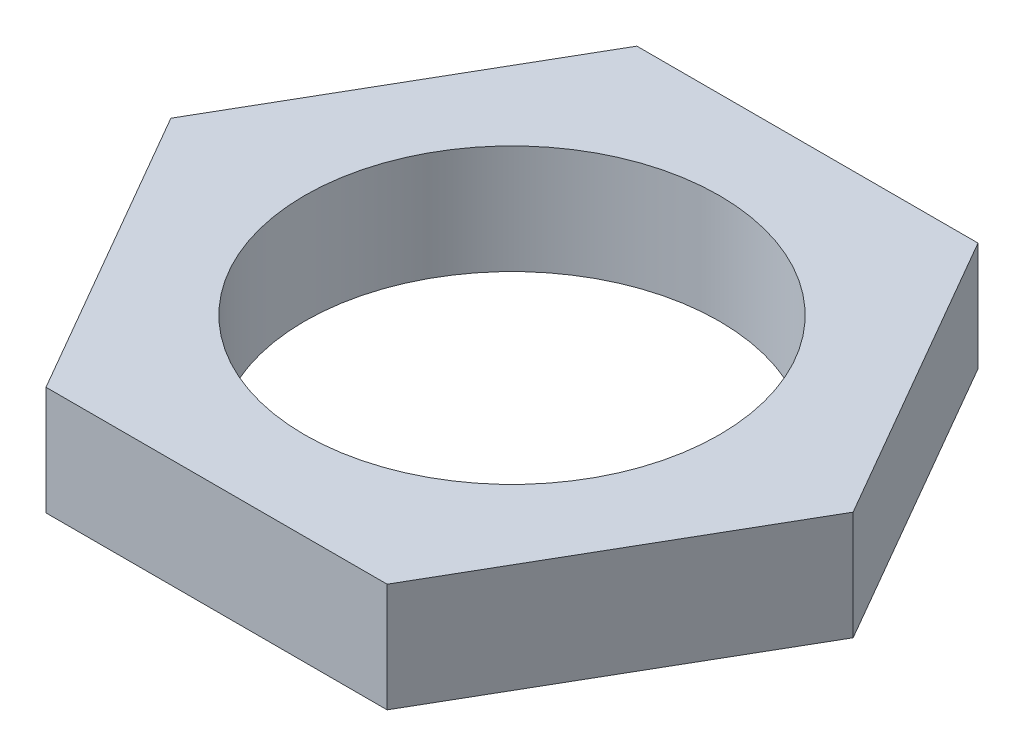
ISO-10303-21;
HEADER;
FILE_DESCRIPTION(('STEP AP214'),'2;1');
FILE_NAME('part.step','',(''),(''),'','','');
FILE_SCHEMA(('AUTOMOTIVE_DESIGN { 1 0 10303 214 1 1 1 1 }'));
ENDSEC;
DATA;
#1=APPLICATION_CONTEXT('core data for automotive mechanical design processes');
#2=APPLICATION_PROTOCOL_DEFINITION('international standard','automotive_design',2000,#1);
#3=PRODUCT_CONTEXT('',#1,'mechanical');
#4=PRODUCT('Part','Part','',(#3));
#5=PRODUCT_RELATED_PRODUCT_CATEGORY('part','',(#4));
#6=PRODUCT_DEFINITION_FORMATION('','',#4);
#7=PRODUCT_DEFINITION_CONTEXT('part definition',#1,'design');
#8=PRODUCT_DEFINITION('design','',#6,#7);
#9=PRODUCT_DEFINITION_SHAPE('','',#8);
#10=(LENGTH_UNIT() NAMED_UNIT(*) SI_UNIT(.MILLI.,.METRE.));
#11=(NAMED_UNIT(*) PLANE_ANGLE_UNIT() SI_UNIT($,.RADIAN.));
#12=(NAMED_UNIT(*) SI_UNIT($,.STERADIAN.) SOLID_ANGLE_UNIT());
#13=UNCERTAINTY_MEASURE_WITH_UNIT(LENGTH_MEASURE(1.E-05),#10,'distance_accuracy_value','');
#14=(GEOMETRIC_REPRESENTATION_CONTEXT(3) GLOBAL_UNCERTAINTY_ASSIGNED_CONTEXT((#13)) GLOBAL_UNIT_ASSIGNED_CONTEXT((#10,
#11,#12)) REPRESENTATION_CONTEXT('',''));
#15=CARTESIAN_POINT('',(0.,0.,0.));
#16=DIRECTION('',(0.,0.,1.));
#17=DIRECTION('',(1.,0.,0.));
#18=AXIS2_PLACEMENT_3D('',#15,#16,#17);
#19=CARTESIAN_POINT('',(0.,2.31,0.));
#20=DIRECTION('',(0.,1.,0.));
#21=DIRECTION('',(0.,0.,1.));
#22=AXIS2_PLACEMENT_3D('',#19,#20,#21);
#23=PLANE('',#22);
#24=DIRECTION('',(0.5,0.,0.866025403784439));
#25=VECTOR('',#24,1.);
#26=CARTESIAN_POINT('',(-7.23997237563791,2.31,0.));
#27=LINE('',#26,#25);
#28=CARTESIAN_POINT('',(-7.23997237563791,2.31,0.));
#29=VERTEX_POINT('',#28);
#30=CARTESIAN_POINT('',(-3.61998618781895,2.31,6.27));
#31=VERTEX_POINT('',#30);
#32=EDGE_CURVE('E148',#29,#31,#27,.T.);
#33=ORIENTED_EDGE('',*,*,#32,.T.);
#34=DIRECTION('',(1.,0.,0.));
#35=VECTOR('',#34,1.);
#36=CARTESIAN_POINT('',(-3.61998618781895,2.31,6.27));
#37=LINE('',#36,#35);
#38=CARTESIAN_POINT('',(3.61998618781895,2.31,6.27));
#39=VERTEX_POINT('',#38);
#40=EDGE_CURVE('E96',#31,#39,#37,.T.);
#41=ORIENTED_EDGE('',*,*,#40,.T.);
#42=DIRECTION('',(0.5,0.,-0.866025403784439));
#43=VECTOR('',#42,1.);
#44=CARTESIAN_POINT('',(3.61998618781895,2.31,6.27));
#45=LINE('',#44,#43);
#46=CARTESIAN_POINT('',(7.23997237563791,2.31,0.));
#47=VERTEX_POINT('',#46);
#48=EDGE_CURVE('E109',#39,#47,#45,.T.);
#49=ORIENTED_EDGE('',*,*,#48,.T.);
#50=DIRECTION('',(-0.5,0.,-0.866025403784438));
#51=VECTOR('',#50,1.);
#52=CARTESIAN_POINT('',(7.23997237563791,2.31,0.));
#53=LINE('',#52,#51);
#54=CARTESIAN_POINT('',(3.61998618781895,2.31,-6.27));
#55=VERTEX_POINT('',#54);
#56=EDGE_CURVE('E103',#47,#55,#53,.T.);
#57=ORIENTED_EDGE('',*,*,#56,.T.);
#58=DIRECTION('',(-1.,0.,0.));
#59=VECTOR('',#58,1.);
#60=CARTESIAN_POINT('',(3.61998618781895,2.31,-6.27));
#61=LINE('',#60,#59);
#62=CARTESIAN_POINT('',(-3.61998618781896,2.31,-6.27));
#63=VERTEX_POINT('',#62);
#64=EDGE_CURVE('E107',#55,#63,#61,.T.);
#65=ORIENTED_EDGE('',*,*,#64,.T.);
#66=DIRECTION('',(-0.5,0.,0.866025403784439));
#67=VECTOR('',#66,1.);
#68=CARTESIAN_POINT('',(-3.61998618781896,2.31,-6.27));
#69=LINE('',#68,#67);
#70=EDGE_CURVE('E59',#63,#29,#69,.T.);
#71=ORIENTED_EDGE('',*,*,#70,.T.);
#72=EDGE_LOOP('',(#33,#41,#49,#57,#65,#71));
#73=FACE_BOUND('',#72,.T.);
#74=CARTESIAN_POINT('',(0.,2.31,0.));
#75=DIRECTION('',(0.,1.,0.));
#76=DIRECTION('',(0.,0.,1.));
#77=AXIS2_PLACEMENT_3D('',#74,#75,#76);
#78=CIRCLE('',#77,4.4);
#79=CARTESIAN_POINT('',(0.,2.31,4.4));
#80=VERTEX_POINT('',#79);
#81=EDGE_CURVE('E136',#80,#80,#78,.T.);
#82=ORIENTED_EDGE('',*,*,#81,.F.);
#83=EDGE_LOOP('',(#82));
#84=FACE_BOUND('',#83,.T.);
#85=ADVANCED_FACE('F41',(#73,#84),#23,.T.);
#86=CARTESIAN_POINT('',(0.,0.,0.));
#87=DIRECTION('',(0.,1.,0.));
#88=DIRECTION('',(0.,0.,1.));
#89=AXIS2_PLACEMENT_3D('',#86,#87,#88);
#90=PLANE('',#89);
#91=DIRECTION('',(0.5,0.,0.866025403784439));
#92=VECTOR('',#91,1.);
#93=CARTESIAN_POINT('',(-7.23997237563791,0.,0.));
#94=LINE('',#93,#92);
#95=CARTESIAN_POINT('',(-7.23997237563791,0.,0.));
#96=VERTEX_POINT('',#95);
#97=CARTESIAN_POINT('',(-3.61998618781895,0.,6.27));
#98=VERTEX_POINT('',#97);
#99=EDGE_CURVE('E131',#96,#98,#94,.T.);
#100=ORIENTED_EDGE('',*,*,#99,.F.);
#101=DIRECTION('',(-0.5,0.,0.866025403784439));
#102=VECTOR('',#101,1.);
#103=CARTESIAN_POINT('',(-3.61998618781896,0.,-6.27));
#104=LINE('',#103,#102);
#105=CARTESIAN_POINT('',(-3.61998618781896,0.,-6.27));
#106=VERTEX_POINT('',#105);
#107=EDGE_CURVE('E88',#106,#96,#104,.T.);
#108=ORIENTED_EDGE('',*,*,#107,.F.);
#109=DIRECTION('',(-1.,0.,0.));
#110=VECTOR('',#109,1.);
#111=CARTESIAN_POINT('',(3.61998618781895,0.,-6.27));
#112=LINE('',#111,#110);
#113=CARTESIAN_POINT('',(3.61998618781895,0.,-6.27));
#114=VERTEX_POINT('',#113);
#115=EDGE_CURVE('E82',#114,#106,#112,.T.);
#116=ORIENTED_EDGE('',*,*,#115,.F.);
#117=DIRECTION('',(-0.5,0.,-0.866025403784438));
#118=VECTOR('',#117,1.);
#119=CARTESIAN_POINT('',(7.23997237563791,0.,0.));
#120=LINE('',#119,#118);
#121=CARTESIAN_POINT('',(7.23997237563791,0.,0.));
#122=VERTEX_POINT('',#121);
#123=EDGE_CURVE('E118',#122,#114,#120,.T.);
#124=ORIENTED_EDGE('',*,*,#123,.F.);
#125=DIRECTION('',(0.5,0.,-0.866025403784439));
#126=VECTOR('',#125,1.);
#127=CARTESIAN_POINT('',(3.61998618781895,0.,6.27));
#128=LINE('',#127,#126);
#129=CARTESIAN_POINT('',(3.61998618781895,0.,6.27));
#130=VERTEX_POINT('',#129);
#131=EDGE_CURVE('E139',#130,#122,#128,.T.);
#132=ORIENTED_EDGE('',*,*,#131,.F.);
#133=DIRECTION('',(1.,0.,0.));
#134=VECTOR('',#133,1.);
#135=CARTESIAN_POINT('',(-3.61998618781895,0.,6.27));
#136=LINE('',#135,#134);
#137=EDGE_CURVE('E135',#98,#130,#136,.T.);
#138=ORIENTED_EDGE('',*,*,#137,.F.);
#139=EDGE_LOOP('',(#100,#108,#116,#124,#132,#138));
#140=FACE_BOUND('',#139,.T.);
#141=CARTESIAN_POINT('',(0.,0.,0.));
#142=DIRECTION('',(0.,1.,0.));
#143=DIRECTION('',(0.,0.,1.));
#144=AXIS2_PLACEMENT_3D('',#141,#142,#143);
#145=CIRCLE('',#144,4.4);
#146=CARTESIAN_POINT('',(0.,0.,4.4));
#147=VERTEX_POINT('',#146);
#148=EDGE_CURVE('E245',#147,#147,#145,.T.);
#149=ORIENTED_EDGE('',*,*,#148,.T.);
#150=EDGE_LOOP('',(#149));
#151=FACE_BOUND('',#150,.T.);
#152=ADVANCED_FACE('F161',(#140,#151),#90,.F.);
#153=CARTESIAN_POINT('',(-7.23997237563791,2.31,0.));
#154=DIRECTION('',(0.866025403784439,0.,-0.5));
#155=DIRECTION('',(-0.5,0.,-0.866025403784439));
#156=AXIS2_PLACEMENT_3D('',#153,#154,#155);
#157=PLANE('',#156);
#158=ORIENTED_EDGE('',*,*,#99,.T.);
#159=DIRECTION('',(0.,-1.,0.));
#160=VECTOR('',#159,1.);
#161=CARTESIAN_POINT('',(-3.61998618781895,2.31,6.27));
#162=LINE('',#161,#160);
#163=EDGE_CURVE('E11',#31,#98,#162,.T.);
#164=ORIENTED_EDGE('',*,*,#163,.F.);
#165=ORIENTED_EDGE('',*,*,#32,.F.);
#166=DIRECTION('',(0.,-1.,0.));
#167=VECTOR('',#166,1.);
#168=CARTESIAN_POINT('',(-7.23997237563791,2.31,0.));
#169=LINE('',#168,#167);
#170=EDGE_CURVE('E127',#29,#96,#169,.T.);
#171=ORIENTED_EDGE('',*,*,#170,.T.);
#172=EDGE_LOOP('',(#158,#164,#165,#171));
#173=FACE_BOUND('',#172,.T.);
#174=ADVANCED_FACE('F43',(#173),#157,.F.);
#175=CARTESIAN_POINT('',(-3.61998618781895,2.31,6.27));
#176=DIRECTION('',(0.,0.,-1.));
#177=DIRECTION('',(-1.,0.,0.));
#178=AXIS2_PLACEMENT_3D('',#175,#176,#177);
#179=PLANE('',#178);
#180=ORIENTED_EDGE('',*,*,#137,.T.);
#181=DIRECTION('',(0.,-1.,0.));
#182=VECTOR('',#181,1.);
#183=CARTESIAN_POINT('',(3.61998618781895,2.31,6.27));
#184=LINE('',#183,#182);
#185=EDGE_CURVE('E51',#39,#130,#184,.T.);
#186=ORIENTED_EDGE('',*,*,#185,.F.);
#187=ORIENTED_EDGE('',*,*,#40,.F.);
#188=ORIENTED_EDGE('',*,*,#163,.T.);
#189=EDGE_LOOP('',(#180,#186,#187,#188));
#190=FACE_BOUND('',#189,.T.);
#191=ADVANCED_FACE('F186',(#190),#179,.F.);
#192=CARTESIAN_POINT('',(3.61998618781895,2.31,6.27));
#193=DIRECTION('',(-0.866025403784439,0.,-0.5));
#194=DIRECTION('',(-0.5,0.,0.866025403784439));
#195=AXIS2_PLACEMENT_3D('',#192,#193,#194);
#196=PLANE('',#195);
#197=ORIENTED_EDGE('',*,*,#131,.T.);
#198=DIRECTION('',(0.,-1.,0.));
#199=VECTOR('',#198,1.);
#200=CARTESIAN_POINT('',(7.23997237563791,2.31,0.));
#201=LINE('',#200,#199);
#202=EDGE_CURVE('E120',#47,#122,#201,.T.);
#203=ORIENTED_EDGE('',*,*,#202,.F.);
#204=ORIENTED_EDGE('',*,*,#48,.F.);
#205=ORIENTED_EDGE('',*,*,#185,.T.);
#206=EDGE_LOOP('',(#197,#203,#204,#205));
#207=FACE_BOUND('',#206,.T.);
#208=ADVANCED_FACE('F158',(#207),#196,.F.);
#209=CARTESIAN_POINT('',(7.23997237563791,2.31,0.));
#210=DIRECTION('',(-0.866025403784438,0.,0.5));
#211=DIRECTION('',(0.5,0.,0.866025403784438));
#212=AXIS2_PLACEMENT_3D('',#209,#210,#211);
#213=PLANE('',#212);
#214=ORIENTED_EDGE('',*,*,#123,.T.);
#215=DIRECTION('',(0.,-1.,0.));
#216=VECTOR('',#215,1.);
#217=CARTESIAN_POINT('',(3.61998618781895,2.31,-6.27));
#218=LINE('',#217,#216);
#219=EDGE_CURVE('E115',#55,#114,#218,.T.);
#220=ORIENTED_EDGE('',*,*,#219,.F.);
#221=ORIENTED_EDGE('',*,*,#56,.F.);
#222=ORIENTED_EDGE('',*,*,#202,.T.);
#223=EDGE_LOOP('',(#214,#220,#221,#222));
#224=FACE_BOUND('',#223,.T.);
#225=ADVANCED_FACE('F116',(#224),#213,.F.);
#226=CARTESIAN_POINT('',(3.61998618781895,2.31,-6.27));
#227=DIRECTION('',(0.,0.,1.));
#228=DIRECTION('',(1.,0.,0.));
#229=AXIS2_PLACEMENT_3D('',#226,#227,#228);
#230=PLANE('',#229);
#231=ORIENTED_EDGE('',*,*,#115,.T.);
#232=DIRECTION('',(0.,-1.,0.));
#233=VECTOR('',#232,1.);
#234=CARTESIAN_POINT('',(-3.61998618781896,2.31,-6.27));
#235=LINE('',#234,#233);
#236=EDGE_CURVE('E121',#63,#106,#235,.T.);
#237=ORIENTED_EDGE('',*,*,#236,.F.);
#238=ORIENTED_EDGE('',*,*,#64,.F.);
#239=ORIENTED_EDGE('',*,*,#219,.T.);
#240=EDGE_LOOP('',(#231,#237,#238,#239));
#241=FACE_BOUND('',#240,.T.);
#242=ADVANCED_FACE('F123',(#241),#230,.F.);
#243=CARTESIAN_POINT('',(-3.61998618781896,2.31,-6.27));
#244=DIRECTION('',(0.866025403784439,0.,0.5));
#245=DIRECTION('',(0.5,0.,-0.866025403784439));
#246=AXIS2_PLACEMENT_3D('',#243,#244,#245);
#247=PLANE('',#246);
#248=ORIENTED_EDGE('',*,*,#107,.T.);
#249=ORIENTED_EDGE('',*,*,#170,.F.);
#250=ORIENTED_EDGE('',*,*,#70,.F.);
#251=ORIENTED_EDGE('',*,*,#236,.T.);
#252=EDGE_LOOP('',(#248,#249,#250,#251));
#253=FACE_BOUND('',#252,.T.);
#254=ADVANCED_FACE('F166',(#253),#247,.F.);
#255=CARTESIAN_POINT('',(0.,2.31,0.));
#256=DIRECTION('',(0.,-1.,0.));
#257=DIRECTION('',(0.,0.,-1.));
#258=AXIS2_PLACEMENT_3D('',#255,#256,#257);
#259=CYLINDRICAL_SURFACE('',#258,4.4);
#260=ORIENTED_EDGE('',*,*,#81,.T.);
#261=EDGE_LOOP('',(#260));
#262=FACE_BOUND('',#261,.T.);
#263=ORIENTED_EDGE('',*,*,#148,.F.);
#264=EDGE_LOOP('',(#263));
#265=FACE_BOUND('',#264,.T.);
#266=ADVANCED_FACE('F168',(#262,#265),#259,.F.);
#267=CLOSED_SHELL('',(#85,#152,#174,#191,#208,#225,#242,#254,#266));
#268=MANIFOLD_SOLID_BREP('B2',#267);
#269=ADVANCED_BREP_SHAPE_REPRESENTATION('',(#18,#268),#14);
#270=SHAPE_DEFINITION_REPRESENTATION(#9,#269);
ENDSEC;
END-ISO-10303-21;
